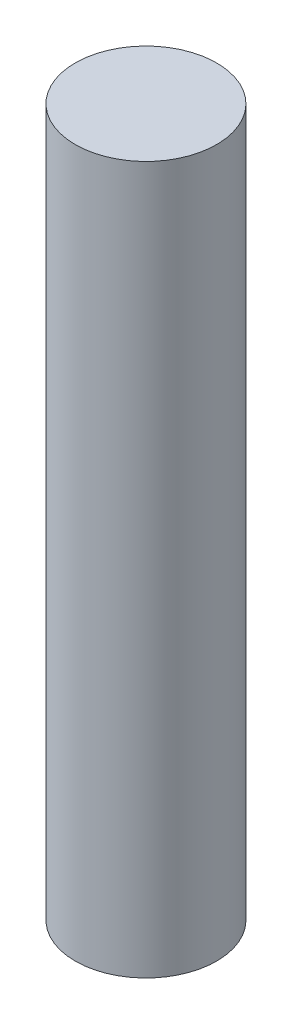
ISO-10303-21;
HEADER;
FILE_DESCRIPTION(('STEP AP214'),'2;1');
FILE_NAME('part.step','',(''),(''),'','','');
FILE_SCHEMA(('AUTOMOTIVE_DESIGN { 1 0 10303 214 1 1 1 1 }'));
ENDSEC;
DATA;
#1=APPLICATION_CONTEXT('core data for automotive mechanical design processes');
#2=APPLICATION_PROTOCOL_DEFINITION('international standard','automotive_design',2000,#1);
#3=PRODUCT_CONTEXT('',#1,'mechanical');
#4=PRODUCT('Part','Part','',(#3));
#5=PRODUCT_RELATED_PRODUCT_CATEGORY('part','',(#4));
#6=PRODUCT_DEFINITION_FORMATION('','',#4);
#7=PRODUCT_DEFINITION_CONTEXT('part definition',#1,'design');
#8=PRODUCT_DEFINITION('design','',#6,#7);
#9=PRODUCT_DEFINITION_SHAPE('','',#8);
#10=(LENGTH_UNIT() NAMED_UNIT(*) SI_UNIT(.MILLI.,.METRE.));
#11=(NAMED_UNIT(*) PLANE_ANGLE_UNIT() SI_UNIT($,.RADIAN.));
#12=(NAMED_UNIT(*) SI_UNIT($,.STERADIAN.) SOLID_ANGLE_UNIT());
#13=UNCERTAINTY_MEASURE_WITH_UNIT(LENGTH_MEASURE(1.E-05),#10,'distance_accuracy_value','');
#14=(GEOMETRIC_REPRESENTATION_CONTEXT(3) GLOBAL_UNCERTAINTY_ASSIGNED_CONTEXT((#13)) GLOBAL_UNIT_ASSIGNED_CONTEXT((#10,
#11,#12)) REPRESENTATION_CONTEXT('',''));
#15=CARTESIAN_POINT('',(0.,0.,0.));
#16=DIRECTION('',(0.,0.,1.));
#17=DIRECTION('',(1.,0.,0.));
#18=AXIS2_PLACEMENT_3D('',#15,#16,#17);
#19=CARTESIAN_POINT('',(0.,10.,0.));
#20=DIRECTION('',(0.,-1.,0.));
#21=DIRECTION('',(0.,0.,-1.));
#22=AXIS2_PLACEMENT_3D('',#19,#20,#21);
#23=CYLINDRICAL_SURFACE('',#22,1.);
#24=CARTESIAN_POINT('',(0.,10.,0.));
#25=DIRECTION('',(0.,1.,0.));
#26=DIRECTION('',(0.,0.,1.));
#27=AXIS2_PLACEMENT_3D('',#24,#25,#26);
#28=CIRCLE('',#27,1.);
#29=CARTESIAN_POINT('',(0.,10.,1.));
#30=VERTEX_POINT('',#29);
#31=EDGE_CURVE('E10',#30,#30,#28,.T.);
#32=ORIENTED_EDGE('',*,*,#31,.F.);
#33=EDGE_LOOP('',(#32));
#34=FACE_BOUND('',#33,.T.);
#35=CARTESIAN_POINT('',(0.,0.,0.));
#36=DIRECTION('',(0.,1.,0.));
#37=DIRECTION('',(0.,0.,1.));
#38=AXIS2_PLACEMENT_3D('',#35,#36,#37);
#39=CIRCLE('',#38,1.);
#40=CARTESIAN_POINT('',(0.,0.,1.));
#41=VERTEX_POINT('',#40);
#42=EDGE_CURVE('E36',#41,#41,#39,.T.);
#43=ORIENTED_EDGE('',*,*,#42,.T.);
#44=EDGE_LOOP('',(#43));
#45=FACE_BOUND('',#44,.T.);
#46=ADVANCED_FACE('F33',(#34,#45),#23,.T.);
#47=CARTESIAN_POINT('',(0.,10.,0.));
#48=DIRECTION('',(0.,1.,0.));
#49=DIRECTION('',(0.,0.,1.));
#50=AXIS2_PLACEMENT_3D('',#47,#48,#49);
#51=PLANE('',#50);
#52=ORIENTED_EDGE('',*,*,#31,.T.);
#53=EDGE_LOOP('',(#52));
#54=FACE_BOUND('',#53,.T.);
#55=ADVANCED_FACE('F48',(#54),#51,.T.);
#56=CARTESIAN_POINT('',(0.,0.,0.));
#57=DIRECTION('',(0.,1.,0.));
#58=DIRECTION('',(0.,0.,1.));
#59=AXIS2_PLACEMENT_3D('',#56,#57,#58);
#60=PLANE('',#59);
#61=ORIENTED_EDGE('',*,*,#42,.F.);
#62=EDGE_LOOP('',(#61));
#63=FACE_BOUND('',#62,.T.);
#64=ADVANCED_FACE('F46',(#63),#60,.F.);
#65=CLOSED_SHELL('',(#46,#55,#64));
#66=MANIFOLD_SOLID_BREP('B2',#65);
#67=ADVANCED_BREP_SHAPE_REPRESENTATION('',(#18,#66),#14);
#68=SHAPE_DEFINITION_REPRESENTATION(#9,#67);
ENDSEC;
END-ISO-10303-21;
